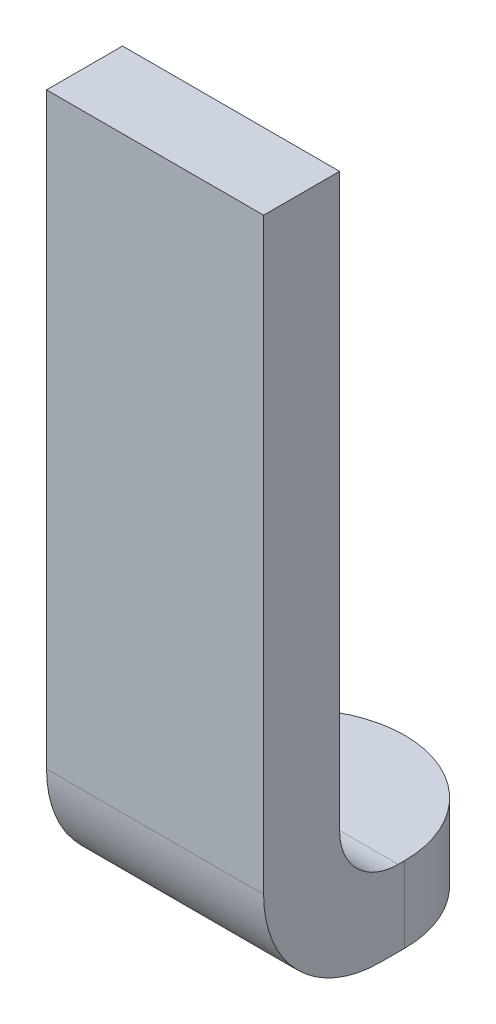
ISO-10303-21;
HEADER;
FILE_DESCRIPTION(('STEP AP214'),'2;1');
FILE_NAME('part.step','',(''),(''),'','','');
FILE_SCHEMA(('AUTOMOTIVE_DESIGN { 1 0 10303 214 1 1 1 1 }'));
ENDSEC;
DATA;
#1=APPLICATION_CONTEXT('core data for automotive mechanical design processes');
#2=APPLICATION_PROTOCOL_DEFINITION('international standard','automotive_design',2000,#1);
#3=PRODUCT_CONTEXT('',#1,'mechanical');
#4=PRODUCT('Part','Part','',(#3));
#5=PRODUCT_RELATED_PRODUCT_CATEGORY('part','',(#4));
#6=PRODUCT_DEFINITION_FORMATION('','',#4);
#7=PRODUCT_DEFINITION_CONTEXT('part definition',#1,'design');
#8=PRODUCT_DEFINITION('design','',#6,#7);
#9=PRODUCT_DEFINITION_SHAPE('','',#8);
#10=(LENGTH_UNIT() NAMED_UNIT(*) SI_UNIT(.MILLI.,.METRE.));
#11=(NAMED_UNIT(*) PLANE_ANGLE_UNIT() SI_UNIT($,.RADIAN.));
#12=(NAMED_UNIT(*) SI_UNIT($,.STERADIAN.) SOLID_ANGLE_UNIT());
#13=UNCERTAINTY_MEASURE_WITH_UNIT(LENGTH_MEASURE(1.E-05),#10,'distance_accuracy_value','');
#14=(GEOMETRIC_REPRESENTATION_CONTEXT(3) GLOBAL_UNCERTAINTY_ASSIGNED_CONTEXT((#13)) GLOBAL_UNIT_ASSIGNED_CONTEXT((#10,
#11,#12)) REPRESENTATION_CONTEXT('',''));
#15=CARTESIAN_POINT('',(0.,0.,0.));
#16=DIRECTION('',(0.,0.,1.));
#17=DIRECTION('',(1.,0.,0.));
#18=AXIS2_PLACEMENT_3D('',#15,#16,#17);
#19=CARTESIAN_POINT('',(0.5,3.15,-11.5));
#20=DIRECTION('',(0.,-1.,0.));
#21=DIRECTION('',(0.,0.,-1.));
#22=AXIS2_PLACEMENT_3D('',#19,#20,#21);
#23=PLANE('',#22);
#24=DIRECTION('',(0.,0.,1.));
#25=VECTOR('',#24,1.);
#26=CARTESIAN_POINT('',(-0.5,3.15,-11.5));
#27=LINE('',#26,#25);
#28=CARTESIAN_POINT('',(-0.5,3.15,-11.5));
#29=VERTEX_POINT('',#28);
#30=CARTESIAN_POINT('',(-0.5,3.15,-11.15));
#31=VERTEX_POINT('',#30);
#32=EDGE_CURVE('E11',#29,#31,#27,.T.);
#33=ORIENTED_EDGE('',*,*,#32,.T.);
#34=DIRECTION('',(-1.,0.,0.));
#35=VECTOR('',#34,1.);
#36=CARTESIAN_POINT('',(0.5,3.15,-11.15));
#37=LINE('',#36,#35);
#38=CARTESIAN_POINT('',(0.5,3.15,-11.15));
#39=VERTEX_POINT('',#38);
#40=EDGE_CURVE('E43',#39,#31,#37,.T.);
#41=ORIENTED_EDGE('',*,*,#40,.F.);
#42=DIRECTION('',(0.,0.,1.));
#43=VECTOR('',#42,1.);
#44=CARTESIAN_POINT('',(0.5,3.15,-11.5));
#45=LINE('',#44,#43);
#46=CARTESIAN_POINT('',(0.5,3.15,-11.5));
#47=VERTEX_POINT('',#46);
#48=EDGE_CURVE('E110',#47,#39,#45,.T.);
#49=ORIENTED_EDGE('',*,*,#48,.F.);
#50=DIRECTION('',(-1.,0.,0.));
#51=VECTOR('',#50,1.);
#52=CARTESIAN_POINT('',(0.5,3.15,-11.5));
#53=LINE('',#52,#51);
#54=EDGE_CURVE('E28',#47,#29,#53,.T.);
#55=ORIENTED_EDGE('',*,*,#54,.T.);
#56=EDGE_LOOP('',(#33,#41,#49,#55));
#57=FACE_BOUND('',#56,.T.);
#58=ADVANCED_FACE('F17',(#57),#23,.F.);
#59=CARTESIAN_POINT('',(0.5,3.15,-11.15));
#60=DIRECTION('',(0.,0.,-1.));
#61=DIRECTION('',(0.,-1.,0.));
#62=AXIS2_PLACEMENT_3D('',#59,#60,#61);
#63=PLANE('',#62);
#64=DIRECTION('',(0.,-1.,0.));
#65=VECTOR('',#64,1.);
#66=CARTESIAN_POINT('',(-0.5,3.15,-11.15));
#67=LINE('',#66,#65);
#68=CARTESIAN_POINT('',(-0.5,0.44,-11.15));
#69=VERTEX_POINT('',#68);
#70=EDGE_CURVE('E123',#31,#69,#67,.T.);
#71=ORIENTED_EDGE('',*,*,#70,.T.);
#72=DIRECTION('',(-1.,0.,0.));
#73=VECTOR('',#72,1.);
#74=CARTESIAN_POINT('',(0.5,0.44,-11.15));
#75=LINE('',#74,#73);
#76=CARTESIAN_POINT('',(0.5,0.44,-11.15));
#77=VERTEX_POINT('',#76);
#78=EDGE_CURVE('E144',#77,#69,#75,.T.);
#79=ORIENTED_EDGE('',*,*,#78,.F.);
#80=DIRECTION('',(0.,-1.,0.));
#81=VECTOR('',#80,1.);
#82=CARTESIAN_POINT('',(0.5,3.15,-11.15));
#83=LINE('',#82,#81);
#84=EDGE_CURVE('E21',#39,#77,#83,.T.);
#85=ORIENTED_EDGE('',*,*,#84,.F.);
#86=ORIENTED_EDGE('',*,*,#40,.T.);
#87=EDGE_LOOP('',(#71,#79,#85,#86));
#88=FACE_BOUND('',#87,.T.);
#89=ADVANCED_FACE('F195',(#88),#63,.F.);
#90=CARTESIAN_POINT('',(0.5,0.44,-11.69));
#91=DIRECTION('',(-1.,0.,0.));
#92=DIRECTION('',(0.,0.,1.));
#93=AXIS2_PLACEMENT_3D('',#90,#91,#92);
#94=CYLINDRICAL_SURFACE('',#93,0.54);
#95=CARTESIAN_POINT('',(-0.5,0.44,-11.69));
#96=DIRECTION('',(1.,0.,0.));
#97=DIRECTION('',(0.,0.,-1.));
#98=AXIS2_PLACEMENT_3D('',#95,#96,#97);
#99=CIRCLE('',#98,0.54);
#100=CARTESIAN_POINT('',(-0.5,-0.1,-11.69));
#101=VERTEX_POINT('',#100);
#102=EDGE_CURVE('E136',#69,#101,#99,.T.);
#103=ORIENTED_EDGE('',*,*,#102,.T.);
#104=DIRECTION('',(-1.,0.,0.));
#105=VECTOR('',#104,1.);
#106=CARTESIAN_POINT('',(0.5,-0.1,-11.69));
#107=LINE('',#106,#105);
#108=CARTESIAN_POINT('',(0.5,-0.1,-11.69));
#109=VERTEX_POINT('',#108);
#110=EDGE_CURVE('E172',#109,#101,#107,.T.);
#111=ORIENTED_EDGE('',*,*,#110,.F.);
#112=CARTESIAN_POINT('',(0.5,0.44,-11.69));
#113=DIRECTION('',(1.,0.,0.));
#114=DIRECTION('',(0.,0.,-1.));
#115=AXIS2_PLACEMENT_3D('',#112,#113,#114);
#116=CIRCLE('',#115,0.54);
#117=EDGE_CURVE('E162',#77,#109,#116,.T.);
#118=ORIENTED_EDGE('',*,*,#117,.F.);
#119=ORIENTED_EDGE('',*,*,#78,.T.);
#120=EDGE_LOOP('',(#103,#111,#118,#119));
#121=FACE_BOUND('',#120,.T.);
#122=ADVANCED_FACE('F203',(#121),#94,.T.);
#123=CARTESIAN_POINT('',(0.5,-0.1,-11.69));
#124=DIRECTION('',(0.,1.,0.));
#125=DIRECTION('',(1.,0.,0.));
#126=AXIS2_PLACEMENT_3D('',#123,#124,#125);
#127=PLANE('',#126);
#128=DIRECTION('',(0.,0.,-1.));
#129=VECTOR('',#128,1.);
#130=CARTESIAN_POINT('',(-0.5,-0.1,-11.69));
#131=LINE('',#130,#129);
#132=CARTESIAN_POINT('',(-0.5,-0.1,-11.8));
#133=VERTEX_POINT('',#132);
#134=EDGE_CURVE('E140',#101,#133,#131,.T.);
#135=ORIENTED_EDGE('',*,*,#134,.T.);
#136=CARTESIAN_POINT('',(0.,-0.1,-11.8));
#137=DIRECTION('',(0.,-1.,0.));
#138=DIRECTION('',(0.,0.,1.));
#139=AXIS2_PLACEMENT_3D('',#136,#137,#138);
#140=CIRCLE('',#139,0.5);
#141=CARTESIAN_POINT('',(0.5,-0.1,-11.8));
#142=VERTEX_POINT('',#141);
#143=EDGE_CURVE('E145',#133,#142,#140,.T.);
#144=ORIENTED_EDGE('',*,*,#143,.T.);
#145=DIRECTION('',(0.,0.,-1.));
#146=VECTOR('',#145,1.);
#147=CARTESIAN_POINT('',(0.5,-0.1,-11.69));
#148=LINE('',#147,#146);
#149=EDGE_CURVE('E139',#109,#142,#148,.T.);
#150=ORIENTED_EDGE('',*,*,#149,.F.);
#151=ORIENTED_EDGE('',*,*,#110,.T.);
#152=EDGE_LOOP('',(#135,#144,#150,#151));
#153=FACE_BOUND('',#152,.T.);
#154=ADVANCED_FACE('F248',(#153),#127,.F.);
#155=CARTESIAN_POINT('',(0.5,0.25,-12.3));
#156=DIRECTION('',(0.,-1.,0.));
#157=DIRECTION('',(0.,0.,-1.));
#158=AXIS2_PLACEMENT_3D('',#155,#156,#157);
#159=PLANE('',#158);
#160=CARTESIAN_POINT('',(0.,0.25,-11.8));
#161=DIRECTION('',(0.,1.,0.));
#162=DIRECTION('',(0.,0.,-1.));
#163=AXIS2_PLACEMENT_3D('',#160,#161,#162);
#164=CIRCLE('',#163,0.5);
#165=CARTESIAN_POINT('',(0.5,0.25,-11.8));
#166=VERTEX_POINT('',#165);
#167=CARTESIAN_POINT('',(-0.5,0.25,-11.8));
#168=VERTEX_POINT('',#167);
#169=EDGE_CURVE('E169',#166,#168,#164,.T.);
#170=ORIENTED_EDGE('',*,*,#169,.T.);
#171=DIRECTION('',(0.,0.,1.));
#172=VECTOR('',#171,1.);
#173=CARTESIAN_POINT('',(-0.5,0.25,-12.3));
#174=LINE('',#173,#172);
#175=CARTESIAN_POINT('',(-0.5,0.25,-11.77));
#176=VERTEX_POINT('',#175);
#177=EDGE_CURVE('E161',#168,#176,#174,.T.);
#178=ORIENTED_EDGE('',*,*,#177,.T.);
#179=DIRECTION('',(-1.,0.,0.));
#180=VECTOR('',#179,1.);
#181=CARTESIAN_POINT('',(0.5,0.25,-11.77));
#182=LINE('',#181,#180);
#183=CARTESIAN_POINT('',(0.5,0.25,-11.77));
#184=VERTEX_POINT('',#183);
#185=EDGE_CURVE('E146',#184,#176,#182,.T.);
#186=ORIENTED_EDGE('',*,*,#185,.F.);
#187=DIRECTION('',(0.,0.,1.));
#188=VECTOR('',#187,1.);
#189=CARTESIAN_POINT('',(0.5,0.25,-12.3));
#190=LINE('',#189,#188);
#191=EDGE_CURVE('E80',#166,#184,#190,.T.);
#192=ORIENTED_EDGE('',*,*,#191,.F.);
#193=EDGE_LOOP('',(#170,#178,#186,#192));
#194=FACE_BOUND('',#193,.T.);
#195=ADVANCED_FACE('F255',(#194),#159,.F.);
#196=CARTESIAN_POINT('',(0.5,0.52,-11.77));
#197=DIRECTION('',(-1.,0.,0.));
#198=DIRECTION('',(0.,0.,1.));
#199=AXIS2_PLACEMENT_3D('',#196,#197,#198);
#200=CYLINDRICAL_SURFACE('',#199,0.27);
#201=CARTESIAN_POINT('',(-0.5,0.52,-11.77));
#202=DIRECTION('',(-1.,0.,0.));
#203=DIRECTION('',(0.,0.,1.));
#204=AXIS2_PLACEMENT_3D('',#201,#202,#203);
#205=CIRCLE('',#204,0.27);
#206=CARTESIAN_POINT('',(-0.5,0.52,-11.5));
#207=VERTEX_POINT('',#206);
#208=EDGE_CURVE('E150',#176,#207,#205,.T.);
#209=ORIENTED_EDGE('',*,*,#208,.T.);
#210=DIRECTION('',(-1.,0.,0.));
#211=VECTOR('',#210,1.);
#212=CARTESIAN_POINT('',(0.5,0.52,-11.5));
#213=LINE('',#212,#211);
#214=CARTESIAN_POINT('',(0.5,0.52,-11.5));
#215=VERTEX_POINT('',#214);
#216=EDGE_CURVE('E94',#215,#207,#213,.T.);
#217=ORIENTED_EDGE('',*,*,#216,.F.);
#218=CARTESIAN_POINT('',(0.5,0.52,-11.77));
#219=DIRECTION('',(-1.,0.,0.));
#220=DIRECTION('',(0.,0.,1.));
#221=AXIS2_PLACEMENT_3D('',#218,#219,#220);
#222=CIRCLE('',#221,0.27);
#223=EDGE_CURVE('E126',#184,#215,#222,.T.);
#224=ORIENTED_EDGE('',*,*,#223,.F.);
#225=ORIENTED_EDGE('',*,*,#185,.T.);
#226=EDGE_LOOP('',(#209,#217,#224,#225));
#227=FACE_BOUND('',#226,.T.);
#228=ADVANCED_FACE('F262',(#227),#200,.F.);
#229=CARTESIAN_POINT('',(0.5,0.52,-11.5));
#230=DIRECTION('',(0.,0.,1.));
#231=DIRECTION('',(1.,0.,0.));
#232=AXIS2_PLACEMENT_3D('',#229,#230,#231);
#233=PLANE('',#232);
#234=DIRECTION('',(0.,1.,0.));
#235=VECTOR('',#234,1.);
#236=CARTESIAN_POINT('',(-0.5,0.52,-11.5));
#237=LINE('',#236,#235);
#238=EDGE_CURVE('E121',#207,#29,#237,.T.);
#239=ORIENTED_EDGE('',*,*,#238,.T.);
#240=ORIENTED_EDGE('',*,*,#54,.F.);
#241=DIRECTION('',(0.,1.,0.));
#242=VECTOR('',#241,1.);
#243=CARTESIAN_POINT('',(0.5,0.52,-11.5));
#244=LINE('',#243,#242);
#245=EDGE_CURVE('E117',#215,#47,#244,.T.);
#246=ORIENTED_EDGE('',*,*,#245,.F.);
#247=ORIENTED_EDGE('',*,*,#216,.T.);
#248=EDGE_LOOP('',(#239,#240,#246,#247));
#249=FACE_BOUND('',#248,.T.);
#250=ADVANCED_FACE('F119',(#249),#233,.F.);
#251=CARTESIAN_POINT('',(0.5,0.44,-11.69));
#252=DIRECTION('',(1.,0.,0.));
#253=DIRECTION('',(0.,1.,0.));
#254=AXIS2_PLACEMENT_3D('',#251,#252,#253);
#255=PLANE('',#254);
#256=ORIENTED_EDGE('',*,*,#149,.T.);
#257=DIRECTION('',(0.,1.,0.));
#258=VECTOR('',#257,1.);
#259=CARTESIAN_POINT('',(0.5,0.25,-11.8));
#260=LINE('',#259,#258);
#261=EDGE_CURVE('E153',#142,#166,#260,.T.);
#262=ORIENTED_EDGE('',*,*,#261,.T.);
#263=ORIENTED_EDGE('',*,*,#191,.T.);
#264=ORIENTED_EDGE('',*,*,#223,.T.);
#265=ORIENTED_EDGE('',*,*,#245,.T.);
#266=ORIENTED_EDGE('',*,*,#48,.T.);
#267=ORIENTED_EDGE('',*,*,#84,.T.);
#268=ORIENTED_EDGE('',*,*,#117,.T.);
#269=EDGE_LOOP('',(#256,#262,#263,#264,#265,#266,#267,#268));
#270=FACE_BOUND('',#269,.T.);
#271=ADVANCED_FACE('F19',(#270),#255,.T.);
#272=CARTESIAN_POINT('',(-0.5,0.44,-11.69));
#273=DIRECTION('',(1.,0.,0.));
#274=DIRECTION('',(0.,1.,0.));
#275=AXIS2_PLACEMENT_3D('',#272,#273,#274);
#276=PLANE('',#275);
#277=ORIENTED_EDGE('',*,*,#177,.F.);
#278=DIRECTION('',(0.,-1.,0.));
#279=VECTOR('',#278,1.);
#280=CARTESIAN_POINT('',(-0.5,0.44,-11.8));
#281=LINE('',#280,#279);
#282=EDGE_CURVE('E165',#168,#133,#281,.T.);
#283=ORIENTED_EDGE('',*,*,#282,.T.);
#284=ORIENTED_EDGE('',*,*,#134,.F.);
#285=ORIENTED_EDGE('',*,*,#102,.F.);
#286=ORIENTED_EDGE('',*,*,#70,.F.);
#287=ORIENTED_EDGE('',*,*,#32,.F.);
#288=ORIENTED_EDGE('',*,*,#238,.F.);
#289=ORIENTED_EDGE('',*,*,#208,.F.);
#290=EDGE_LOOP('',(#277,#283,#284,#285,#286,#287,#288,#289));
#291=FACE_BOUND('',#290,.T.);
#292=ADVANCED_FACE('F200',(#291),#276,.F.);
#293=CARTESIAN_POINT('',(0.,0.44,-11.8));
#294=DIRECTION('',(0.,-1.,0.));
#295=DIRECTION('',(0.,0.,-1.));
#296=AXIS2_PLACEMENT_3D('',#293,#294,#295);
#297=CYLINDRICAL_SURFACE('',#296,0.5);
#298=ORIENTED_EDGE('',*,*,#261,.F.);
#299=ORIENTED_EDGE('',*,*,#143,.F.);
#300=ORIENTED_EDGE('',*,*,#282,.F.);
#301=ORIENTED_EDGE('',*,*,#169,.F.);
#302=EDGE_LOOP('',(#298,#299,#300,#301));
#303=FACE_BOUND('',#302,.T.);
#304=ADVANCED_FACE('F287',(#303),#297,.T.);
#305=CLOSED_SHELL('',(#58,#89,#122,#154,#195,#228,#250,#271,#292,#304));
#306=MANIFOLD_SOLID_BREP('B1',#305);
#307=ADVANCED_BREP_SHAPE_REPRESENTATION('',(#18,#306),#14);
#308=SHAPE_DEFINITION_REPRESENTATION(#9,#307);
ENDSEC;
END-ISO-10303-21;
